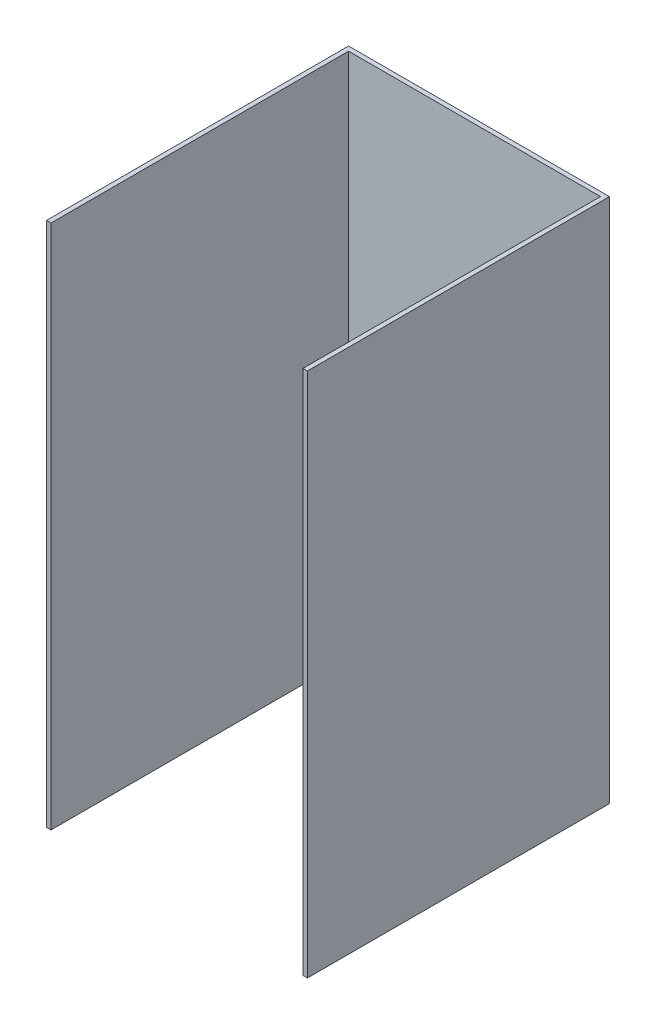
ISO-10303-21;
HEADER;
FILE_DESCRIPTION(('STEP AP214'),'2;1');
FILE_NAME('part.step','',(''),(''),'','','');
FILE_SCHEMA(('AUTOMOTIVE_DESIGN { 1 0 10303 214 1 1 1 1 }'));
ENDSEC;
DATA;
#1=APPLICATION_CONTEXT('core data for automotive mechanical design processes');
#2=APPLICATION_PROTOCOL_DEFINITION('international standard','automotive_design',2000,#1);
#3=PRODUCT_CONTEXT('',#1,'mechanical');
#4=PRODUCT('Part','Part','',(#3));
#5=PRODUCT_RELATED_PRODUCT_CATEGORY('part','',(#4));
#6=PRODUCT_DEFINITION_FORMATION('','',#4);
#7=PRODUCT_DEFINITION_CONTEXT('part definition',#1,'design');
#8=PRODUCT_DEFINITION('design','',#6,#7);
#9=PRODUCT_DEFINITION_SHAPE('','',#8);
#10=(LENGTH_UNIT() NAMED_UNIT(*) SI_UNIT(.MILLI.,.METRE.));
#11=(NAMED_UNIT(*) PLANE_ANGLE_UNIT() SI_UNIT($,.RADIAN.));
#12=(NAMED_UNIT(*) SI_UNIT($,.STERADIAN.) SOLID_ANGLE_UNIT());
#13=UNCERTAINTY_MEASURE_WITH_UNIT(LENGTH_MEASURE(1.E-05),#10,'distance_accuracy_value','');
#14=(GEOMETRIC_REPRESENTATION_CONTEXT(3) GLOBAL_UNCERTAINTY_ASSIGNED_CONTEXT((#13)) GLOBAL_UNIT_ASSIGNED_CONTEXT((#10,
#11,#12)) REPRESENTATION_CONTEXT('',''));
#15=CARTESIAN_POINT('',(0.,0.,0.));
#16=DIRECTION('',(0.,0.,1.));
#17=DIRECTION('',(1.,0.,0.));
#18=AXIS2_PLACEMENT_3D('',#15,#16,#17);
#19=CARTESIAN_POINT('',(129.032,269.24,0.));
#20=DIRECTION('',(1.,0.,0.));
#21=DIRECTION('',(0.,0.,-1.));
#22=AXIS2_PLACEMENT_3D('',#19,#20,#21);
#23=PLANE('',#22);
#24=DIRECTION('',(0.,0.,1.));
#25=VECTOR('',#24,1.);
#26=CARTESIAN_POINT('',(129.032,0.,0.));
#27=LINE('',#26,#25);
#28=CARTESIAN_POINT('',(129.032,0.,0.));
#29=VERTEX_POINT('',#28);
#30=CARTESIAN_POINT('',(129.032,0.,152.4));
#31=VERTEX_POINT('',#30);
#32=EDGE_CURVE('E132',#29,#31,#27,.T.);
#33=ORIENTED_EDGE('',*,*,#32,.T.);
#34=DIRECTION('',(0.,-1.,0.));
#35=VECTOR('',#34,1.);
#36=CARTESIAN_POINT('',(129.032,269.24,152.4));
#37=LINE('',#36,#35);
#38=CARTESIAN_POINT('',(129.032,269.24,152.4));
#39=VERTEX_POINT('',#38);
#40=EDGE_CURVE('E11',#39,#31,#37,.T.);
#41=ORIENTED_EDGE('',*,*,#40,.F.);
#42=DIRECTION('',(0.,0.,1.));
#43=VECTOR('',#42,1.);
#44=CARTESIAN_POINT('',(129.032,269.24,0.));
#45=LINE('',#44,#43);
#46=CARTESIAN_POINT('',(129.032,269.24,0.));
#47=VERTEX_POINT('',#46);
#48=EDGE_CURVE('E150',#47,#39,#45,.T.);
#49=ORIENTED_EDGE('',*,*,#48,.F.);
#50=DIRECTION('',(0.,-1.,0.));
#51=VECTOR('',#50,1.);
#52=CARTESIAN_POINT('',(129.032,269.24,0.));
#53=LINE('',#52,#51);
#54=EDGE_CURVE('E128',#47,#29,#53,.T.);
#55=ORIENTED_EDGE('',*,*,#54,.T.);
#56=EDGE_LOOP('',(#33,#41,#49,#55));
#57=FACE_BOUND('',#56,.T.);
#58=ADVANCED_FACE('F36',(#57),#23,.F.);
#59=CARTESIAN_POINT('',(0.,269.24,152.4));
#60=DIRECTION('',(0.,0.,-1.));
#61=DIRECTION('',(-1.,0.,0.));
#62=AXIS2_PLACEMENT_3D('',#59,#60,#61);
#63=PLANE('',#62);
#64=DIRECTION('',(1.,0.,0.));
#65=VECTOR('',#64,1.);
#66=CARTESIAN_POINT('',(0.,0.,152.4));
#67=LINE('',#66,#65);
#68=CARTESIAN_POINT('',(131.318,0.,152.4));
#69=VERTEX_POINT('',#68);
#70=EDGE_CURVE('E135',#31,#69,#67,.T.);
#71=ORIENTED_EDGE('',*,*,#70,.T.);
#72=DIRECTION('',(0.,-1.,0.));
#73=VECTOR('',#72,1.);
#74=CARTESIAN_POINT('',(131.318,269.24,152.4));
#75=LINE('',#74,#73);
#76=CARTESIAN_POINT('',(131.318,269.24,152.4));
#77=VERTEX_POINT('',#76);
#78=EDGE_CURVE('E44',#77,#69,#75,.T.);
#79=ORIENTED_EDGE('',*,*,#78,.F.);
#80=DIRECTION('',(1.,0.,0.));
#81=VECTOR('',#80,1.);
#82=CARTESIAN_POINT('',(0.,269.24,152.4));
#83=LINE('',#82,#81);
#84=EDGE_CURVE('E91',#39,#77,#83,.T.);
#85=ORIENTED_EDGE('',*,*,#84,.F.);
#86=ORIENTED_EDGE('',*,*,#40,.T.);
#87=EDGE_LOOP('',(#71,#79,#85,#86));
#88=FACE_BOUND('',#87,.T.);
#89=ADVANCED_FACE('F163',(#88),#63,.F.);
#90=CARTESIAN_POINT('',(131.318,269.24,0.));
#91=DIRECTION('',(1.,0.,0.));
#92=DIRECTION('',(0.,0.,-1.));
#93=AXIS2_PLACEMENT_3D('',#90,#91,#92);
#94=PLANE('',#93);
#95=DIRECTION('',(0.,0.,1.));
#96=VECTOR('',#95,1.);
#97=CARTESIAN_POINT('',(131.318,0.,0.));
#98=LINE('',#97,#96);
#99=CARTESIAN_POINT('',(131.318,0.,-2.286));
#100=VERTEX_POINT('',#99);
#101=EDGE_CURVE('E138',#100,#69,#98,.T.);
#102=ORIENTED_EDGE('',*,*,#101,.F.);
#103=DIRECTION('',(0.,-1.,0.));
#104=VECTOR('',#103,1.);
#105=CARTESIAN_POINT('',(131.318,269.24,-2.286));
#106=LINE('',#105,#104);
#107=CARTESIAN_POINT('',(131.318,269.24,-2.286));
#108=VERTEX_POINT('',#107);
#109=EDGE_CURVE('E156',#108,#100,#106,.T.);
#110=ORIENTED_EDGE('',*,*,#109,.F.);
#111=DIRECTION('',(0.,0.,1.));
#112=VECTOR('',#111,1.);
#113=CARTESIAN_POINT('',(131.318,269.24,0.));
#114=LINE('',#113,#112);
#115=EDGE_CURVE('E162',#108,#77,#114,.T.);
#116=ORIENTED_EDGE('',*,*,#115,.T.);
#117=ORIENTED_EDGE('',*,*,#78,.T.);
#118=EDGE_LOOP('',(#102,#110,#116,#117));
#119=FACE_BOUND('',#118,.T.);
#120=ADVANCED_FACE('F160',(#119),#94,.T.);
#121=CARTESIAN_POINT('',(0.,269.24,-2.286));
#122=DIRECTION('',(0.,0.,-1.));
#123=DIRECTION('',(-1.,0.,0.));
#124=AXIS2_PLACEMENT_3D('',#121,#122,#123);
#125=PLANE('',#124);
#126=DIRECTION('',(1.,0.,0.));
#127=VECTOR('',#126,1.);
#128=CARTESIAN_POINT('',(0.,0.,-2.286));
#129=LINE('',#128,#127);
#130=CARTESIAN_POINT('',(-2.286,0.,-2.286));
#131=VERTEX_POINT('',#130);
#132=EDGE_CURVE('E141',#131,#100,#129,.T.);
#133=ORIENTED_EDGE('',*,*,#132,.F.);
#134=DIRECTION('',(0.,-1.,0.));
#135=VECTOR('',#134,1.);
#136=CARTESIAN_POINT('',(-2.286,269.24,-2.286));
#137=LINE('',#136,#135);
#138=CARTESIAN_POINT('',(-2.286,269.24,-2.286));
#139=VERTEX_POINT('',#138);
#140=EDGE_CURVE('E154',#139,#131,#137,.T.);
#141=ORIENTED_EDGE('',*,*,#140,.F.);
#142=DIRECTION('',(1.,0.,0.));
#143=VECTOR('',#142,1.);
#144=CARTESIAN_POINT('',(0.,269.24,-2.286));
#145=LINE('',#144,#143);
#146=EDGE_CURVE('E173',#139,#108,#145,.T.);
#147=ORIENTED_EDGE('',*,*,#146,.T.);
#148=ORIENTED_EDGE('',*,*,#109,.T.);
#149=EDGE_LOOP('',(#133,#141,#147,#148));
#150=FACE_BOUND('',#149,.T.);
#151=ADVANCED_FACE('F171',(#150),#125,.T.);
#152=CARTESIAN_POINT('',(-2.286,269.24,0.));
#153=DIRECTION('',(1.,0.,0.));
#154=DIRECTION('',(0.,0.,-1.));
#155=AXIS2_PLACEMENT_3D('',#152,#153,#154);
#156=PLANE('',#155);
#157=DIRECTION('',(0.,0.,1.));
#158=VECTOR('',#157,1.);
#159=CARTESIAN_POINT('',(-2.286,0.,0.));
#160=LINE('',#159,#158);
#161=CARTESIAN_POINT('',(-2.286,0.,152.4));
#162=VERTEX_POINT('',#161);
#163=EDGE_CURVE('E144',#131,#162,#160,.T.);
#164=ORIENTED_EDGE('',*,*,#163,.T.);
#165=DIRECTION('',(0.,-1.,0.));
#166=VECTOR('',#165,1.);
#167=CARTESIAN_POINT('',(-2.286,269.24,152.4));
#168=LINE('',#167,#166);
#169=CARTESIAN_POINT('',(-2.286,269.24,152.4));
#170=VERTEX_POINT('',#169);
#171=EDGE_CURVE('E124',#170,#162,#168,.T.);
#172=ORIENTED_EDGE('',*,*,#171,.F.);
#173=DIRECTION('',(0.,0.,1.));
#174=VECTOR('',#173,1.);
#175=CARTESIAN_POINT('',(-2.286,269.24,0.));
#176=LINE('',#175,#174);
#177=EDGE_CURVE('E111',#139,#170,#176,.T.);
#178=ORIENTED_EDGE('',*,*,#177,.F.);
#179=ORIENTED_EDGE('',*,*,#140,.T.);
#180=EDGE_LOOP('',(#164,#172,#178,#179));
#181=FACE_BOUND('',#180,.T.);
#182=ADVANCED_FACE('F201',(#181),#156,.F.);
#183=CARTESIAN_POINT('',(0.,269.24,152.4));
#184=DIRECTION('',(0.,0.,-1.));
#185=DIRECTION('',(-1.,0.,0.));
#186=AXIS2_PLACEMENT_3D('',#183,#184,#185);
#187=PLANE('',#186);
#188=DIRECTION('',(1.,0.,0.));
#189=VECTOR('',#188,1.);
#190=CARTESIAN_POINT('',(0.,0.,152.4));
#191=LINE('',#190,#189);
#192=CARTESIAN_POINT('',(0.,0.,152.4));
#193=VERTEX_POINT('',#192);
#194=EDGE_CURVE('E120',#162,#193,#191,.T.);
#195=ORIENTED_EDGE('',*,*,#194,.T.);
#196=DIRECTION('',(0.,-1.,0.));
#197=VECTOR('',#196,1.);
#198=CARTESIAN_POINT('',(0.,269.24,152.4));
#199=LINE('',#198,#197);
#200=CARTESIAN_POINT('',(0.,269.24,152.4));
#201=VERTEX_POINT('',#200);
#202=EDGE_CURVE('E117',#201,#193,#199,.T.);
#203=ORIENTED_EDGE('',*,*,#202,.F.);
#204=DIRECTION('',(1.,0.,0.));
#205=VECTOR('',#204,1.);
#206=CARTESIAN_POINT('',(0.,269.24,152.4));
#207=LINE('',#206,#205);
#208=EDGE_CURVE('E104',#170,#201,#207,.T.);
#209=ORIENTED_EDGE('',*,*,#208,.F.);
#210=ORIENTED_EDGE('',*,*,#171,.T.);
#211=EDGE_LOOP('',(#195,#203,#209,#210));
#212=FACE_BOUND('',#211,.T.);
#213=ADVANCED_FACE('F118',(#212),#187,.F.);
#214=CARTESIAN_POINT('',(0.,269.24,0.));
#215=DIRECTION('',(1.,0.,0.));
#216=DIRECTION('',(0.,0.,-1.));
#217=AXIS2_PLACEMENT_3D('',#214,#215,#216);
#218=PLANE('',#217);
#219=DIRECTION('',(0.,0.,1.));
#220=VECTOR('',#219,1.);
#221=CARTESIAN_POINT('',(0.,0.,0.));
#222=LINE('',#221,#220);
#223=CARTESIAN_POINT('',(0.,0.,0.));
#224=VERTEX_POINT('',#223);
#225=EDGE_CURVE('E147',#224,#193,#222,.T.);
#226=ORIENTED_EDGE('',*,*,#225,.F.);
#227=DIRECTION('',(0.,-1.,0.));
#228=VECTOR('',#227,1.);
#229=CARTESIAN_POINT('',(0.,269.24,0.));
#230=LINE('',#229,#228);
#231=CARTESIAN_POINT('',(0.,269.24,0.));
#232=VERTEX_POINT('',#231);
#233=EDGE_CURVE('E80',#232,#224,#230,.T.);
#234=ORIENTED_EDGE('',*,*,#233,.F.);
#235=DIRECTION('',(0.,0.,1.));
#236=VECTOR('',#235,1.);
#237=CARTESIAN_POINT('',(0.,269.24,0.));
#238=LINE('',#237,#236);
#239=EDGE_CURVE('E108',#232,#201,#238,.T.);
#240=ORIENTED_EDGE('',*,*,#239,.T.);
#241=ORIENTED_EDGE('',*,*,#202,.T.);
#242=EDGE_LOOP('',(#226,#234,#240,#241));
#243=FACE_BOUND('',#242,.T.);
#244=ADVANCED_FACE('F126',(#243),#218,.T.);
#245=CARTESIAN_POINT('',(0.,269.24,0.));
#246=DIRECTION('',(0.,0.,-1.));
#247=DIRECTION('',(-1.,0.,0.));
#248=AXIS2_PLACEMENT_3D('',#245,#246,#247);
#249=PLANE('',#248);
#250=DIRECTION('',(1.,0.,0.));
#251=VECTOR('',#250,1.);
#252=CARTESIAN_POINT('',(0.,0.,0.));
#253=LINE('',#252,#251);
#254=EDGE_CURVE('E83',#224,#29,#253,.T.);
#255=ORIENTED_EDGE('',*,*,#254,.T.);
#256=ORIENTED_EDGE('',*,*,#54,.F.);
#257=DIRECTION('',(1.,0.,0.));
#258=VECTOR('',#257,1.);
#259=CARTESIAN_POINT('',(0.,269.24,0.));
#260=LINE('',#259,#258);
#261=EDGE_CURVE('E52',#232,#47,#260,.T.);
#262=ORIENTED_EDGE('',*,*,#261,.F.);
#263=ORIENTED_EDGE('',*,*,#233,.T.);
#264=EDGE_LOOP('',(#255,#256,#262,#263));
#265=FACE_BOUND('',#264,.T.);
#266=ADVANCED_FACE('F180',(#265),#249,.F.);
#267=CARTESIAN_POINT('',(0.,269.24,0.));
#268=DIRECTION('',(0.,1.,0.));
#269=DIRECTION('',(0.,0.,1.));
#270=AXIS2_PLACEMENT_3D('',#267,#268,#269);
#271=PLANE('',#270);
#272=ORIENTED_EDGE('',*,*,#48,.T.);
#273=ORIENTED_EDGE('',*,*,#84,.T.);
#274=ORIENTED_EDGE('',*,*,#115,.F.);
#275=ORIENTED_EDGE('',*,*,#146,.F.);
#276=ORIENTED_EDGE('',*,*,#177,.T.);
#277=ORIENTED_EDGE('',*,*,#208,.T.);
#278=ORIENTED_EDGE('',*,*,#239,.F.);
#279=ORIENTED_EDGE('',*,*,#261,.T.);
#280=EDGE_LOOP('',(#272,#273,#274,#275,#276,#277,#278,#279));
#281=FACE_BOUND('',#280,.T.);
#282=ADVANCED_FACE('F106',(#281),#271,.T.);
#283=CARTESIAN_POINT('',(0.,0.,0.));
#284=DIRECTION('',(0.,1.,0.));
#285=DIRECTION('',(0.,0.,1.));
#286=AXIS2_PLACEMENT_3D('',#283,#284,#285);
#287=PLANE('',#286);
#288=ORIENTED_EDGE('',*,*,#32,.F.);
#289=ORIENTED_EDGE('',*,*,#254,.F.);
#290=ORIENTED_EDGE('',*,*,#225,.T.);
#291=ORIENTED_EDGE('',*,*,#194,.F.);
#292=ORIENTED_EDGE('',*,*,#163,.F.);
#293=ORIENTED_EDGE('',*,*,#132,.T.);
#294=ORIENTED_EDGE('',*,*,#101,.T.);
#295=ORIENTED_EDGE('',*,*,#70,.F.);
#296=EDGE_LOOP('',(#288,#289,#290,#291,#292,#293,#294,#295));
#297=FACE_BOUND('',#296,.T.);
#298=ADVANCED_FACE('F167',(#297),#287,.F.);
#299=CLOSED_SHELL('',(#58,#89,#120,#151,#182,#213,#244,#266,#282,#298));
#300=MANIFOLD_SOLID_BREP('B2',#299);
#301=ADVANCED_BREP_SHAPE_REPRESENTATION('',(#18,#300),#14);
#302=SHAPE_DEFINITION_REPRESENTATION(#9,#301);
ENDSEC;
END-ISO-10303-21;
